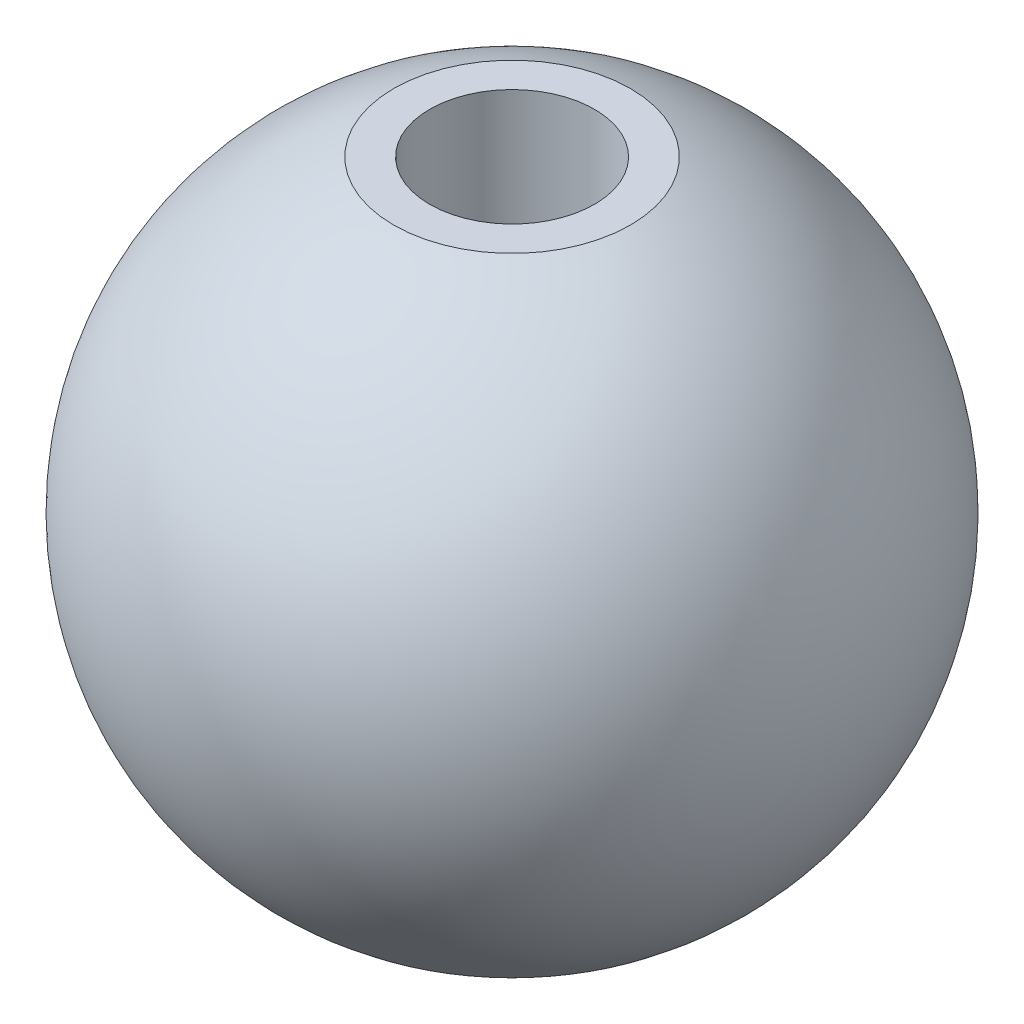
ISO-10303-21;
HEADER;
FILE_DESCRIPTION(('STEP AP214'),'2;1');
FILE_NAME('part.step','',(''),(''),'','','');
FILE_SCHEMA(('AUTOMOTIVE_DESIGN { 1 0 10303 214 1 1 1 1 }'));
ENDSEC;
DATA;
#1=APPLICATION_CONTEXT('core data for automotive mechanical design processes');
#2=APPLICATION_PROTOCOL_DEFINITION('international standard','automotive_design',2000,#1);
#3=PRODUCT_CONTEXT('',#1,'mechanical');
#4=PRODUCT('Part','Part','',(#3));
#5=PRODUCT_RELATED_PRODUCT_CATEGORY('part','',(#4));
#6=PRODUCT_DEFINITION_FORMATION('','',#4);
#7=PRODUCT_DEFINITION_CONTEXT('part definition',#1,'design');
#8=PRODUCT_DEFINITION('design','',#6,#7);
#9=PRODUCT_DEFINITION_SHAPE('','',#8);
#10=(LENGTH_UNIT() NAMED_UNIT(*) SI_UNIT(.MILLI.,.METRE.));
#11=(NAMED_UNIT(*) PLANE_ANGLE_UNIT() SI_UNIT($,.RADIAN.));
#12=(NAMED_UNIT(*) SI_UNIT($,.STERADIAN.) SOLID_ANGLE_UNIT());
#13=UNCERTAINTY_MEASURE_WITH_UNIT(LENGTH_MEASURE(1.E-05),#10,'distance_accuracy_value','');
#14=(GEOMETRIC_REPRESENTATION_CONTEXT(3) GLOBAL_UNCERTAINTY_ASSIGNED_CONTEXT((#13)) GLOBAL_UNIT_ASSIGNED_CONTEXT((#10,
#11,#12)) REPRESENTATION_CONTEXT('',''));
#15=CARTESIAN_POINT('',(0.,0.,0.));
#16=DIRECTION('',(0.,0.,1.));
#17=DIRECTION('',(1.,0.,0.));
#18=AXIS2_PLACEMENT_3D('',#15,#16,#17);
#19=CARTESIAN_POINT('',(0.,0.,0.));
#20=DIRECTION('',(0.,1.,0.));
#21=DIRECTION('',(1.,0.,0.));
#22=AXIS2_PLACEMENT_3D('',#19,#20,#21);
#23=SPHERICAL_SURFACE('',#22,19.05);
#24=CARTESIAN_POINT('',(0.,17.78,0.));
#25=DIRECTION('',(0.,1.,0.));
#26=DIRECTION('',(0.,0.,1.));
#27=AXIS2_PLACEMENT_3D('',#24,#25,#26);
#28=CIRCLE('',#27,6.83915930506084);
#29=CARTESIAN_POINT('',(6.83915930506084,17.78,0.));
#30=VERTEX_POINT('',#29);
#31=EDGE_CURVE('E11',#30,#30,#28,.F.);
#32=CARTESIAN_POINT('',(0.,-17.78,0.));
#33=DIRECTION('',(0.,-1.,0.));
#34=DIRECTION('',(0.,0.,-1.));
#35=AXIS2_PLACEMENT_3D('',#32,#33,#34);
#36=CIRCLE('',#35,6.83915930506088);
#37=CARTESIAN_POINT('',(6.83915930506088,-17.78,0.));
#38=VERTEX_POINT('',#37);
#39=EDGE_CURVE('E69',#38,#38,#36,.F.);
#40=CARTESIAN_POINT('',(6.83915930506084,17.78,0.));
#41=CARTESIAN_POINT('',(7.06207478552291,17.6942569716804,0.));
#42=CARTESIAN_POINT('',(7.28337599061939,17.6043176695928,0.));
#43=CARTESIAN_POINT('',(7.72244076475688,17.4161829479608,0.));
#44=CARTESIAN_POINT('',(7.94020433379788,17.3179875284165,0.));
#45=CARTESIAN_POINT('',(8.37188475050009,17.1134770019506,0.));
#46=CARTESIAN_POINT('',(8.5858015981613,17.0071618950291,0.));
#47=CARTESIAN_POINT('',(9.00948626880937,16.7865630384321,0.));
#48=CARTESIAN_POINT('',(9.21925409179622,16.6722792887567,0.));
#49=CARTESIAN_POINT('',(9.63434391934935,16.4359046245015,0.));
#50=CARTESIAN_POINT('',(9.83966592391563,16.3138137099216,0.));
#51=CARTESIAN_POINT('',(10.2455737057843,16.0619974616542,0.));
#52=CARTESIAN_POINT('',(10.4461594830866,15.9322721279665,0.));
#53=CARTESIAN_POINT('',(10.842311075211,15.6653705260116,0.));
#54=CARTESIAN_POINT('',(11.037876890033,15.5281942577444,0.));
#55=CARTESIAN_POINT('',(11.4237119296584,15.2465848266799,0.));
#56=CARTESIAN_POINT('',(11.6139811544618,15.1021516638826,0.));
#57=CARTESIAN_POINT('',(11.9889538767174,14.8062327444056,0.));
#58=CARTESIAN_POINT('',(12.1736573741697,14.6547469877258,0.));
#59=CARTESIAN_POINT('',(12.5372373776413,14.3449371582251,0.));
#60=CARTESIAN_POINT('',(12.7161138836606,14.1866130854042,0.));
#61=CARTESIAN_POINT('',(13.0677868823648,13.8633505738906,0.));
#62=CARTESIAN_POINT('',(13.2405833750498,13.698412135198,0.));
#63=CARTESIAN_POINT('',(13.5798519254346,13.3621541983533,0.));
#64=CARTESIAN_POINT('',(13.7463239831345,13.1908347002013,0.));
#65=CARTESIAN_POINT('',(14.0727081878392,12.8420569768739,0.));
#66=CARTESIAN_POINT('',(14.2326203348442,12.6645987516986,0.));
#67=CARTESIAN_POINT('',(14.5456585214843,12.3037945900325,0.));
#68=CARTESIAN_POINT('',(14.6987845611194,12.1204486535416,0.));
#69=CARTESIAN_POINT('',(14.9980339353333,11.7481284131531,0.));
#70=CARTESIAN_POINT('',(15.144157269912,11.5591541092553,0.));
#71=CARTESIAN_POINT('',(15.4291945416943,11.1758444393207,0.));
#72=CARTESIAN_POINT('',(15.5681084788977,10.9815090732838,0.));
#73=CARTESIAN_POINT('',(15.8385304613457,10.5877521675928,0.));
#74=CARTESIAN_POINT('',(15.9700385065902,10.3883306279387,0.));
#75=CARTESIAN_POINT('',(16.2254626862143,9.98468345795751,0.));
#76=CARTESIAN_POINT('',(16.3493788205939,9.78045782763049,0.));
#77=CARTESIAN_POINT('',(16.589443898385,9.36749135466257,0.));
#78=CARTESIAN_POINT('',(16.7055928417966,9.15875051202167,0.));
#79=CARTESIAN_POINT('',(16.9299592442859,8.73704887957944,0.));
#80=CARTESIAN_POINT('',(17.0381767033637,8.52408808977812,0.));
#81=CARTESIAN_POINT('',(17.2465270629511,8.09424779730868,0.));
#82=CARTESIAN_POINT('',(17.3466599634608,7.87736829464055,0.));
#83=CARTESIAN_POINT('',(17.5386995673335,7.43999735377358,0.));
#84=CARTESIAN_POINT('',(17.6306062706965,7.21950591557474,0.));
#85=CARTESIAN_POINT('',(17.8060634777018,6.77522299008654,0.));
#86=CARTESIAN_POINT('',(17.889613981344,6.55143150279718,0.));
#87=CARTESIAN_POINT('',(18.0482406062273,6.10086503350706,0.));
#88=CARTESIAN_POINT('',(18.1233167274684,5.8740900515063,0.));
#89=CARTESIAN_POINT('',(18.2648883919331,5.41787736734336,0.));
#90=CARTESIAN_POINT('',(18.3313839351566,5.18843966518118,0.));
#91=CARTESIAN_POINT('',(18.4557003852479,4.72722608167877,0.));
#92=CARTESIAN_POINT('',(18.5135212921156,4.49545020033853,0.));
#93=CARTESIAN_POINT('',(18.6204066814815,4.02988810683161,0.));
#94=CARTESIAN_POINT('',(18.6694711639795,3.79610189466492,0.));
#95=CARTESIAN_POINT('',(18.7587743026061,3.3268498314815,0.));
#96=CARTESIAN_POINT('',(18.7990129587345,3.09138398046478,0.));
#97=CARTESIAN_POINT('',(18.8706075268053,2.61910570741678,0.));
#98=CARTESIAN_POINT('',(18.9019634387476,2.3822932853855,0.));
#99=CARTESIAN_POINT('',(18.9557481653236,1.90765684287652,0.));
#100=CARTESIAN_POINT('',(18.9781769799573,1.66983282239882,0.));
#101=CARTESIAN_POINT('',(19.0140757862256,1.19350958647709,0.));
#102=CARTESIAN_POINT('',(19.0275457778601,0.955010371033055,0.));
#103=CARTESIAN_POINT('',(19.0455078847473,0.477674103726023,0.));
#104=CARTESIAN_POINT('',(19.05,0.238837051863022,0.));
#105=CARTESIAN_POINT('',(19.05,-0.23883705186298,0.));
#106=CARTESIAN_POINT('',(19.0455078847473,-0.47767410372598,0.));
#107=CARTESIAN_POINT('',(19.0275457778601,-0.955010371033013,0.));
#108=CARTESIAN_POINT('',(19.0140757862256,-1.19350958647705,0.));
#109=CARTESIAN_POINT('',(18.9781769799573,-1.66983282239878,0.));
#110=CARTESIAN_POINT('',(18.9557481653236,-1.90765684287648,0.));
#111=CARTESIAN_POINT('',(18.9019634387476,-2.38229328538546,0.));
#112=CARTESIAN_POINT('',(18.8706075268053,-2.61910570741674,0.));
#113=CARTESIAN_POINT('',(18.7990129587345,-3.09138398046474,0.));
#114=CARTESIAN_POINT('',(18.7587743026061,-3.32684983148146,0.));
#115=CARTESIAN_POINT('',(18.6694711639796,-3.79610189466488,0.));
#116=CARTESIAN_POINT('',(18.6204066814815,-4.02988810683157,0.));
#117=CARTESIAN_POINT('',(18.5135212921156,-4.49545020033849,0.));
#118=CARTESIAN_POINT('',(18.4557003852479,-4.72722608167873,0.));
#119=CARTESIAN_POINT('',(18.3313839351566,-5.18843966518114,0.));
#120=CARTESIAN_POINT('',(18.2648883919331,-5.41787736734332,0.));
#121=CARTESIAN_POINT('',(18.1233167274684,-5.87409005150626,0.));
#122=CARTESIAN_POINT('',(18.0482406062274,-6.10086503350702,0.));
#123=CARTESIAN_POINT('',(17.889613981344,-6.55143150279714,0.));
#124=CARTESIAN_POINT('',(17.8060634777018,-6.7752229900865,0.));
#125=CARTESIAN_POINT('',(17.6306062706965,-7.2195059155747,0.));
#126=CARTESIAN_POINT('',(17.5386995673335,-7.43999735377354,0.));
#127=CARTESIAN_POINT('',(17.3466599634608,-7.87736829464051,0.));
#128=CARTESIAN_POINT('',(17.2465270629512,-8.09424779730864,0.));
#129=CARTESIAN_POINT('',(17.0381767033637,-8.52408808977808,0.));
#130=CARTESIAN_POINT('',(16.9299592442859,-8.7370488795794,0.));
#131=CARTESIAN_POINT('',(16.7055928417966,-9.15875051202163,0.));
#132=CARTESIAN_POINT('',(16.5894438983851,-9.36749135466253,0.));
#133=CARTESIAN_POINT('',(16.3493788205939,-9.78045782763045,0.));
#134=CARTESIAN_POINT('',(16.2254626862143,-9.98468345795748,0.));
#135=CARTESIAN_POINT('',(15.9700385065902,-10.3883306279386,0.));
#136=CARTESIAN_POINT('',(15.8385304613457,-10.5877521675928,0.));
#137=CARTESIAN_POINT('',(15.5681084788978,-10.9815090732838,0.));
#138=CARTESIAN_POINT('',(15.4291945416943,-11.1758444393206,0.));
#139=CARTESIAN_POINT('',(15.1441572699121,-11.5591541092552,0.));
#140=CARTESIAN_POINT('',(14.9980339353333,-11.748128413153,0.));
#141=CARTESIAN_POINT('',(14.6987845611194,-12.1204486535416,0.));
#142=CARTESIAN_POINT('',(14.5456585214843,-12.3037945900324,0.));
#143=CARTESIAN_POINT('',(14.2326203348442,-12.6645987516986,0.));
#144=CARTESIAN_POINT('',(14.0727081878393,-12.8420569768739,0.));
#145=CARTESIAN_POINT('',(13.7463239831345,-13.1908347002012,0.));
#146=CARTESIAN_POINT('',(13.5798519254346,-13.3621541983533,0.));
#147=CARTESIAN_POINT('',(13.2405833750498,-13.698412135198,0.));
#148=CARTESIAN_POINT('',(13.0677868823648,-13.8633505738906,0.));
#149=CARTESIAN_POINT('',(12.7161138836606,-14.1866130854041,0.));
#150=CARTESIAN_POINT('',(12.5372373776413,-14.3449371582251,0.));
#151=CARTESIAN_POINT('',(12.1736573741698,-14.6547469877258,0.));
#152=CARTESIAN_POINT('',(11.9889538767175,-14.8062327444055,0.));
#153=CARTESIAN_POINT('',(11.6139811544618,-15.1021516638826,0.));
#154=CARTESIAN_POINT('',(11.4237119296584,-15.2465848266798,0.));
#155=CARTESIAN_POINT('',(11.037876890033,-15.5281942577443,0.));
#156=CARTESIAN_POINT('',(10.842311075211,-15.6653705260116,0.));
#157=CARTESIAN_POINT('',(10.4461594830867,-15.9322721279665,0.));
#158=CARTESIAN_POINT('',(10.2455737057843,-16.0619974616541,0.));
#159=CARTESIAN_POINT('',(9.83966592391567,-16.3138137099216,0.));
#160=CARTESIAN_POINT('',(9.63434391934939,-16.4359046245015,0.));
#161=CARTESIAN_POINT('',(9.21925409179626,-16.6722792887567,0.));
#162=CARTESIAN_POINT('',(9.0094862688094,-16.7865630384321,0.));
#163=CARTESIAN_POINT('',(8.58580159816134,-17.007161895029,0.));
#164=CARTESIAN_POINT('',(8.37188475050013,-17.1134770019506,0.));
#165=CARTESIAN_POINT('',(7.94020433379791,-17.3179875284165,0.));
#166=CARTESIAN_POINT('',(7.72244076475691,-17.4161829479608,0.));
#167=CARTESIAN_POINT('',(7.28337599061943,-17.6043176695927,0.));
#168=CARTESIAN_POINT('',(7.06207478552295,-17.6942569716804,0.));
#169=CARTESIAN_POINT('',(6.83915930506088,-17.78,0.));
#170=B_SPLINE_CURVE_WITH_KNOTS('',3,(#40,#41,#42,#43,#44,#45,#46,#47,#48,#49,#50,#51,#52,#53,
#54,#55,#56,#57,#58,#59,#60,#61,#62,#63,#64,#65,#66,#67,#68,#69,#70,#71,#72,#73,#74,#75,#76,#77,
#78,#79,#80,#81,#82,#83,#84,#85,#86,#87,#88,#89,#90,#91,#92,#93,#94,#95,#96,#97,#98,#99,#100,
#101,#102,#103,#104,#105,#106,#107,#108,#109,#110,#111,#112,#113,#114,#115,#116,#117,#118,#119,
#120,#121,#122,#123,#124,#125,#126,#127,#128,#129,#130,#131,#132,#133,#134,#135,#136,#137,#138,
#139,#140,#141,#142,#143,#144,#145,#146,#147,#148,#149,#150,#151,#152,#153,#154,#155,#156,#157,
#158,#159,#160,#161,#162,#163,#164,#165,#166,#167,#168,#169),.UNSPECIFIED.,.F.,.F.,(4,2,2,2,2,2,
2,2,2,2,2,2,2,2,2,2,2,2,2,2,2,2,2,2,2,2,2,2,2,2,2,2,2,2,2,2,2,2,2,2,2,2,2,2,2,2,2,2,2,2,2,2,2,2,
2,2,2,2,2,2,2,2,2,2,4),(0.,0.716468929771985,1.43293785954397,2.14940678931595,2.86587571908793,
3.58234464885992,4.2988135786319,5.01528250840388,5.73175143817586,6.44822036794785,
7.16468929771983,7.88115822749181,8.5976271572638,9.31409608703578,10.0305650168078,
10.7470339465797,11.4635028763517,12.1799718061237,12.8964407358957,13.6129096656677,
14.3293785954397,15.0458475252116,15.7623164549836,16.4787853847556,17.1952543145276,
17.9117232442996,18.6281921740716,19.3446611038435,20.0611300336155,20.7775989633875,
21.4940678931595,22.2105368229315,22.9270057527035,23.6434746824754,24.3599436122474,
25.0764125420194,25.7928814717914,26.5093504015634,27.2258193313354,27.9422882611073,
28.6587571908793,29.3752261206513,30.0916950504233,30.8081639801953,31.5246329099672,
32.2411018397392,32.9575707695112,33.6740396992832,34.3905086290552,35.1069775588272,
35.8234464885991,36.5399154183711,37.2563843481431,37.9728532779151,38.6893222076871,
39.4057911374591,40.122260067231,40.838728997003,41.555197926775,42.271666856547,
42.988135786319,43.704604716091,44.4210736458629,45.1375425756349,45.8540115054069),.UNSPECIFIED.);
#171=EDGE_CURVE('BSEAM57',#30,#38,#170,.T.);
#172=ORIENTED_EDGE('',*,*,#31,.T.);
#173=ORIENTED_EDGE('',*,*,#39,.T.);
#174=ORIENTED_EDGE('',*,*,#171,.T.);
#175=ORIENTED_EDGE('',*,*,#171,.F.);
#176=EDGE_LOOP('',(#172,#174,#173,#175));
#177=FACE_BOUND('',#176,.T.);
#178=ADVANCED_FACE('F57',(#177),#23,.T.);
#179=CARTESIAN_POINT('',(0.,-19.05,0.));
#180=DIRECTION('',(0.,1.,0.));
#181=DIRECTION('',(0.,0.,1.));
#182=AXIS2_PLACEMENT_3D('',#179,#180,#181);
#183=CYLINDRICAL_SURFACE('',#182,4.7625);
#184=CARTESIAN_POINT('',(0.,17.78,0.));
#185=DIRECTION('',(0.,1.,0.));
#186=DIRECTION('',(0.,0.,1.));
#187=AXIS2_PLACEMENT_3D('',#184,#185,#186);
#188=CIRCLE('',#187,4.7625);
#189=CARTESIAN_POINT('',(0.,17.78,4.7625));
#190=VERTEX_POINT('',#189);
#191=EDGE_CURVE('E64',#190,#190,#188,.F.);
#192=CARTESIAN_POINT('',(0.,-17.78,0.));
#193=DIRECTION('',(0.,-1.,0.));
#194=DIRECTION('',(0.,0.,-1.));
#195=AXIS2_PLACEMENT_3D('',#192,#193,#194);
#196=CIRCLE('',#195,4.7625);
#197=CARTESIAN_POINT('',(0.,-17.78,4.7625));
#198=VERTEX_POINT('',#197);
#199=EDGE_CURVE('E60',#198,#198,#196,.F.);
#200=CARTESIAN_POINT('',(0.,17.78,4.7625));
#201=CARTESIAN_POINT('',(0.,17.4095833333333,4.7625));
#202=CARTESIAN_POINT('',(0.,17.0391666666666,4.7625));
#203=CARTESIAN_POINT('',(0.,16.2983333333333,4.7625));
#204=CARTESIAN_POINT('',(0.,15.9279166666666,4.7625));
#205=CARTESIAN_POINT('',(0.,15.1870833333333,4.7625));
#206=CARTESIAN_POINT('',(0.,14.8166666666667,4.7625));
#207=CARTESIAN_POINT('',(0.,14.0758333333333,4.7625));
#208=CARTESIAN_POINT('',(0.,13.7054166666666,4.7625));
#209=CARTESIAN_POINT('',(0.,12.9645833333333,4.7625));
#210=CARTESIAN_POINT('',(0.,12.5941666666667,4.7625));
#211=CARTESIAN_POINT('',(0.,11.8533333333333,4.7625));
#212=CARTESIAN_POINT('',(0.,11.4829166666667,4.7625));
#213=CARTESIAN_POINT('',(0.,10.7420833333333,4.7625));
#214=CARTESIAN_POINT('',(0.,10.3716666666667,4.7625));
#215=CARTESIAN_POINT('',(0.,9.63083333333333,4.7625));
#216=CARTESIAN_POINT('',(0.,9.26041666666666,4.7625));
#217=CARTESIAN_POINT('',(0.,8.51958333333333,4.7625));
#218=CARTESIAN_POINT('',(0.,8.14916666666666,4.7625));
#219=CARTESIAN_POINT('',(0.,7.40833333333333,4.7625));
#220=CARTESIAN_POINT('',(0.,7.03791666666666,4.7625));
#221=CARTESIAN_POINT('',(0.,6.29708333333333,4.7625));
#222=CARTESIAN_POINT('',(0.,5.92666666666666,4.7625));
#223=CARTESIAN_POINT('',(0.,5.18583333333333,4.7625));
#224=CARTESIAN_POINT('',(0.,4.81541666666666,4.7625));
#225=CARTESIAN_POINT('',(0.,4.07458333333333,4.7625));
#226=CARTESIAN_POINT('',(0.,3.70416666666667,4.7625));
#227=CARTESIAN_POINT('',(0.,2.96333333333333,4.7625));
#228=CARTESIAN_POINT('',(0.,2.59291666666667,4.7625));
#229=CARTESIAN_POINT('',(0.,1.85208333333334,4.7625));
#230=CARTESIAN_POINT('',(0.,1.48166666666667,4.7625));
#231=CARTESIAN_POINT('',(0.,0.740833333333335,4.7625));
#232=CARTESIAN_POINT('',(0.,0.370416666666669,4.7625));
#233=CARTESIAN_POINT('',(0.,-0.370416666666662,4.7625));
#234=CARTESIAN_POINT('',(0.,-0.740833333333328,4.7625));
#235=CARTESIAN_POINT('',(0.,-1.48166666666666,4.7625));
#236=CARTESIAN_POINT('',(0.,-1.85208333333333,4.7625));
#237=CARTESIAN_POINT('',(0.,-2.59291666666666,4.7625));
#238=CARTESIAN_POINT('',(0.,-2.96333333333333,4.7625));
#239=CARTESIAN_POINT('',(0.,-3.70416666666666,4.7625));
#240=CARTESIAN_POINT('',(0.,-4.07458333333332,4.7625));
#241=CARTESIAN_POINT('',(0.,-4.81541666666666,4.7625));
#242=CARTESIAN_POINT('',(0.,-5.18583333333332,4.7625));
#243=CARTESIAN_POINT('',(0.,-5.92666666666666,4.7625));
#244=CARTESIAN_POINT('',(0.,-6.29708333333332,4.7625));
#245=CARTESIAN_POINT('',(0.,-7.03791666666665,4.7625));
#246=CARTESIAN_POINT('',(0.,-7.40833333333332,4.7625));
#247=CARTESIAN_POINT('',(0.,-8.14916666666665,4.7625));
#248=CARTESIAN_POINT('',(0.,-8.51958333333332,4.7625));
#249=CARTESIAN_POINT('',(0.,-9.26041666666665,4.7625));
#250=CARTESIAN_POINT('',(0.,-9.63083333333332,4.7625));
#251=CARTESIAN_POINT('',(0.,-10.3716666666667,4.7625));
#252=CARTESIAN_POINT('',(0.,-10.7420833333333,4.7625));
#253=CARTESIAN_POINT('',(0.,-11.4829166666666,4.7625));
#254=CARTESIAN_POINT('',(0.,-11.8533333333333,4.7625));
#255=CARTESIAN_POINT('',(0.,-12.5941666666666,4.7625));
#256=CARTESIAN_POINT('',(0.,-12.9645833333333,4.7625));
#257=CARTESIAN_POINT('',(0.,-13.7054166666666,4.7625));
#258=CARTESIAN_POINT('',(0.,-14.0758333333333,4.7625));
#259=CARTESIAN_POINT('',(0.,-14.8166666666666,4.7625));
#260=CARTESIAN_POINT('',(0.,-15.1870833333333,4.7625));
#261=CARTESIAN_POINT('',(0.,-15.9279166666666,4.7625));
#262=CARTESIAN_POINT('',(0.,-16.2983333333333,4.7625));
#263=CARTESIAN_POINT('',(0.,-17.0391666666666,4.7625));
#264=CARTESIAN_POINT('',(0.,-17.4095833333333,4.7625));
#265=CARTESIAN_POINT('',(0.,-17.78,4.7625));
#266=B_SPLINE_CURVE_WITH_KNOTS('',3,(#200,#201,#202,#203,#204,#205,#206,#207,#208,#209,#210,
#211,#212,#213,#214,#215,#216,#217,#218,#219,#220,#221,#222,#223,#224,#225,#226,#227,#228,#229,
#230,#231,#232,#233,#234,#235,#236,#237,#238,#239,#240,#241,#242,#243,#244,#245,#246,#247,#248,
#249,#250,#251,#252,#253,#254,#255,#256,#257,#258,#259,#260,#261,#262,#263,#264,#265),
.UNSPECIFIED.,.F.,.F.,(4,2,2,2,2,2,2,2,2,2,2,2,2,2,2,2,2,2,2,2,2,2,2,2,2,2,2,2,2,2,2,2,4),(0.,
1.11125,2.2225,3.33375,4.445,5.55624999999999,6.66749999999999,7.77874999999999,
8.88999999999998,10.00125,11.1125,12.22375,13.335,14.44625,15.5575,16.66875,17.78,18.89125,
20.0025,21.11375,22.225,23.33625,24.4475,25.55875,26.67,27.78125,28.8925,30.00375,31.115,
32.22625,33.3375,34.44875,35.56),.UNSPECIFIED.);
#267=EDGE_CURVE('BSEAM79',#190,#198,#266,.T.);
#268=ORIENTED_EDGE('',*,*,#191,.F.);
#269=ORIENTED_EDGE('',*,*,#199,.F.);
#270=ORIENTED_EDGE('',*,*,#267,.T.);
#271=ORIENTED_EDGE('',*,*,#267,.F.);
#272=EDGE_LOOP('',(#268,#270,#269,#271));
#273=FACE_BOUND('',#272,.T.);
#274=ADVANCED_FACE('F79',(#273),#183,.F.);
#275=CARTESIAN_POINT('',(0.,17.78,0.));
#276=DIRECTION('',(0.,1.,0.));
#277=DIRECTION('',(0.,0.,1.));
#278=AXIS2_PLACEMENT_3D('',#275,#276,#277);
#279=PLANE('',#278);
#280=ORIENTED_EDGE('',*,*,#31,.F.);
#281=EDGE_LOOP('',(#280));
#282=FACE_BOUND('',#281,.T.);
#283=ORIENTED_EDGE('',*,*,#191,.T.);
#284=EDGE_LOOP('',(#283));
#285=FACE_BOUND('',#284,.T.);
#286=ADVANCED_FACE('F81',(#282,#285),#279,.T.);
#287=CARTESIAN_POINT('',(0.,-17.78,0.));
#288=DIRECTION('',(0.,-1.,0.));
#289=DIRECTION('',(0.,0.,-1.));
#290=AXIS2_PLACEMENT_3D('',#287,#288,#289);
#291=PLANE('',#290);
#292=ORIENTED_EDGE('',*,*,#39,.F.);
#293=EDGE_LOOP('',(#292));
#294=FACE_BOUND('',#293,.T.);
#295=ORIENTED_EDGE('',*,*,#199,.T.);
#296=EDGE_LOOP('',(#295));
#297=FACE_BOUND('',#296,.T.);
#298=ADVANCED_FACE('F77',(#294,#297),#291,.T.);
#299=CLOSED_SHELL('',(#178,#274,#286,#298));
#300=MANIFOLD_SOLID_BREP('B2',#299);
#301=ADVANCED_BREP_SHAPE_REPRESENTATION('',(#18,#300),#14);
#302=SHAPE_DEFINITION_REPRESENTATION(#9,#301);
ENDSEC;
END-ISO-10303-21;
